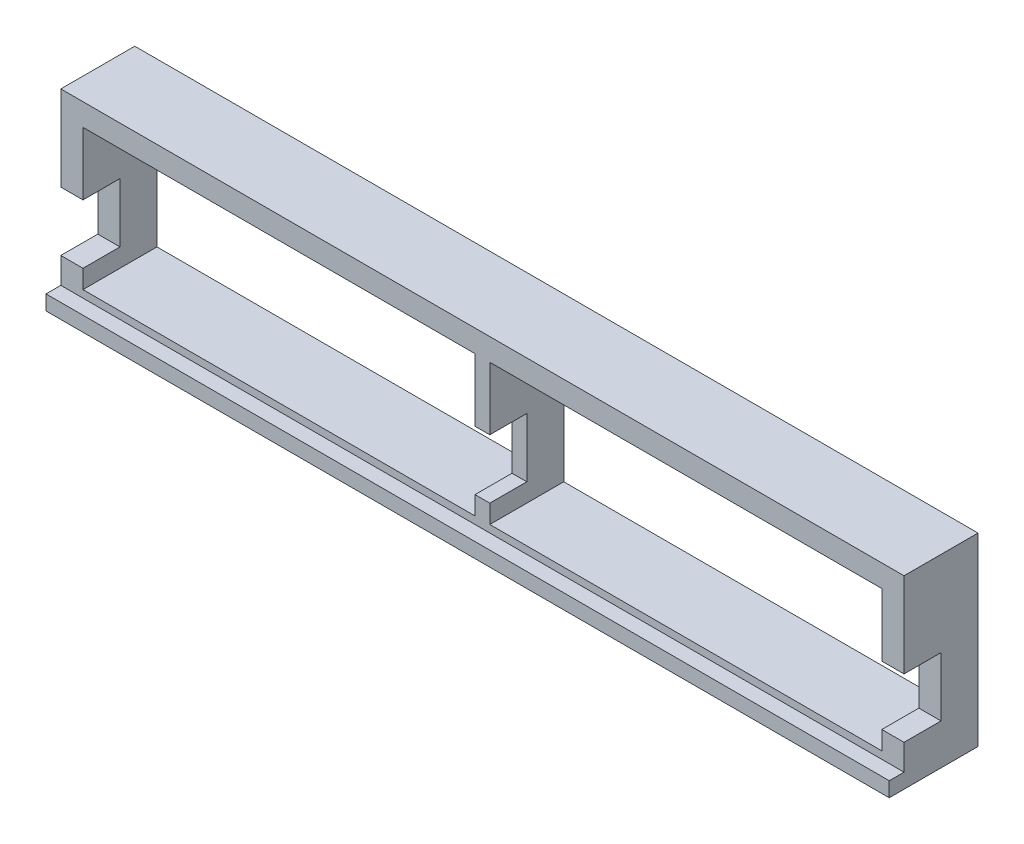
ISO-10303-21;
HEADER;
FILE_DESCRIPTION(('STEP AP214'),'2;1');
FILE_NAME('part.step','',(''),(''),'','','');
FILE_SCHEMA(('AUTOMOTIVE_DESIGN { 1 0 10303 214 1 1 1 1 }'));
ENDSEC;
DATA;
#1=APPLICATION_CONTEXT('core data for automotive mechanical design processes');
#2=APPLICATION_PROTOCOL_DEFINITION('international standard','automotive_design',2000,#1);
#3=PRODUCT_CONTEXT('',#1,'mechanical');
#4=PRODUCT('Part','Part','',(#3));
#5=PRODUCT_RELATED_PRODUCT_CATEGORY('part','',(#4));
#6=PRODUCT_DEFINITION_FORMATION('','',#4);
#7=PRODUCT_DEFINITION_CONTEXT('part definition',#1,'design');
#8=PRODUCT_DEFINITION('design','',#6,#7);
#9=PRODUCT_DEFINITION_SHAPE('','',#8);
#10=(LENGTH_UNIT() NAMED_UNIT(*) SI_UNIT(.MILLI.,.METRE.));
#11=(NAMED_UNIT(*) PLANE_ANGLE_UNIT() SI_UNIT($,.RADIAN.));
#12=(NAMED_UNIT(*) SI_UNIT($,.STERADIAN.) SOLID_ANGLE_UNIT());
#13=UNCERTAINTY_MEASURE_WITH_UNIT(LENGTH_MEASURE(1.E-05),#10,'distance_accuracy_value','');
#14=(GEOMETRIC_REPRESENTATION_CONTEXT(3) GLOBAL_UNCERTAINTY_ASSIGNED_CONTEXT((#13)) GLOBAL_UNIT_ASSIGNED_CONTEXT((#10,
#11,#12)) REPRESENTATION_CONTEXT('',''));
#15=CARTESIAN_POINT('',(0.,0.,0.));
#16=DIRECTION('',(0.,0.,1.));
#17=DIRECTION('',(1.,0.,0.));
#18=AXIS2_PLACEMENT_3D('',#15,#16,#17);
#19=CARTESIAN_POINT('',(0.,0.,10.));
#20=DIRECTION('',(0.,0.,1.));
#21=DIRECTION('',(1.,0.,0.));
#22=AXIS2_PLACEMENT_3D('',#19,#20,#21);
#23=PLANE('',#22);
#24=DIRECTION('',(1.,0.,0.));
#25=VECTOR('',#24,1.);
#26=CARTESIAN_POINT('',(0.,-7.,10.));
#27=LINE('',#26,#25);
#28=CARTESIAN_POINT('',(-57.,-7.,10.));
#29=VERTEX_POINT('',#28);
#30=CARTESIAN_POINT('',(-54.,-7.,10.));
#31=VERTEX_POINT('',#30);
#32=EDGE_CURVE('E11',#29,#31,#27,.T.);
#33=ORIENTED_EDGE('',*,*,#32,.F.);
#34=DIRECTION('',(0.,1.,0.));
#35=VECTOR('',#34,1.);
#36=CARTESIAN_POINT('',(-57.,0.,10.));
#37=LINE('',#36,#35);
#38=CARTESIAN_POINT('',(-57.,-10.5,10.));
#39=VERTEX_POINT('',#38);
#40=EDGE_CURVE('E232',#39,#29,#37,.T.);
#41=ORIENTED_EDGE('',*,*,#40,.F.);
#42=DIRECTION('',(-1.,0.,0.));
#43=VECTOR('',#42,1.);
#44=CARTESIAN_POINT('',(-57.,-10.5,10.));
#45=LINE('',#44,#43);
#46=CARTESIAN_POINT('',(57.,-10.5,10.));
#47=VERTEX_POINT('',#46);
#48=EDGE_CURVE('E252',#47,#39,#45,.T.);
#49=ORIENTED_EDGE('',*,*,#48,.F.);
#50=DIRECTION('',(0.,1.,0.));
#51=VECTOR('',#50,1.);
#52=CARTESIAN_POINT('',(57.,0.,10.));
#53=LINE('',#52,#51);
#54=CARTESIAN_POINT('',(57.,-7.,10.));
#55=VERTEX_POINT('',#54);
#56=EDGE_CURVE('E237',#47,#55,#53,.T.);
#57=ORIENTED_EDGE('',*,*,#56,.T.);
#58=CARTESIAN_POINT('',(54.,-7.,10.));
#59=VERTEX_POINT('',#58);
#60=EDGE_CURVE('E39',#59,#55,#27,.T.);
#61=ORIENTED_EDGE('',*,*,#60,.F.);
#62=DIRECTION('',(0.,1.,0.));
#63=VECTOR('',#62,1.);
#64=CARTESIAN_POINT('',(54.,0.,10.));
#65=LINE('',#64,#63);
#66=CARTESIAN_POINT('',(54.,-9.5,10.));
#67=VERTEX_POINT('',#66);
#68=EDGE_CURVE('E279',#67,#59,#65,.T.);
#69=ORIENTED_EDGE('',*,*,#68,.F.);
#70=DIRECTION('',(1.,0.,0.));
#71=VECTOR('',#70,1.);
#72=CARTESIAN_POINT('',(0.,-9.5,10.));
#73=LINE('',#72,#71);
#74=CARTESIAN_POINT('',(0.999999999999991,-9.5,10.));
#75=VERTEX_POINT('',#74);
#76=EDGE_CURVE('E265',#75,#67,#73,.T.);
#77=ORIENTED_EDGE('',*,*,#76,.F.);
#78=DIRECTION('',(0.,-1.,0.));
#79=VECTOR('',#78,1.);
#80=CARTESIAN_POINT('',(0.999999999999992,0.,10.));
#81=LINE('',#80,#79);
#82=CARTESIAN_POINT('',(0.999999999999994,-7.,10.));
#83=VERTEX_POINT('',#82);
#84=EDGE_CURVE('E268',#83,#75,#81,.T.);
#85=ORIENTED_EDGE('',*,*,#84,.F.);
#86=CARTESIAN_POINT('',(-1.00000000000001,-7.,10.));
#87=VERTEX_POINT('',#86);
#88=EDGE_CURVE('E44',#87,#83,#27,.T.);
#89=ORIENTED_EDGE('',*,*,#88,.F.);
#90=DIRECTION('',(0.,-1.,0.));
#91=VECTOR('',#90,1.);
#92=CARTESIAN_POINT('',(-1.00000000000001,0.,10.));
#93=LINE('',#92,#91);
#94=CARTESIAN_POINT('',(-1.00000000000001,-9.5,10.));
#95=VERTEX_POINT('',#94);
#96=EDGE_CURVE('E282',#87,#95,#93,.T.);
#97=ORIENTED_EDGE('',*,*,#96,.T.);
#98=CARTESIAN_POINT('',(-54.,-9.5,10.));
#99=VERTEX_POINT('',#98);
#100=EDGE_CURVE('E270',#99,#95,#73,.T.);
#101=ORIENTED_EDGE('',*,*,#100,.F.);
#102=DIRECTION('',(0.,1.,0.));
#103=VECTOR('',#102,1.);
#104=CARTESIAN_POINT('',(-54.,0.,10.));
#105=LINE('',#104,#103);
#106=EDGE_CURVE('E286',#99,#31,#105,.T.);
#107=ORIENTED_EDGE('',*,*,#106,.T.);
#108=EDGE_LOOP('',(#33,#41,#49,#57,#61,#69,#77,#85,#89,#97,#101,#107));
#109=FACE_BOUND('',#108,.T.);
#110=ADVANCED_FACE('F35',(#109),#23,.T.);
#111=CARTESIAN_POINT('',(0.,-12.5,10.));
#112=DIRECTION('',(0.,1.,0.));
#113=DIRECTION('',(0.,0.,1.));
#114=AXIS2_PLACEMENT_3D('',#111,#112,#113);
#115=PLANE('',#114);
#116=DIRECTION('',(1.,0.,0.));
#117=VECTOR('',#116,1.);
#118=CARTESIAN_POINT('',(0.,-12.5,0.));
#119=LINE('',#118,#117);
#120=CARTESIAN_POINT('',(-57.,-12.5,0.));
#121=VERTEX_POINT('',#120);
#122=CARTESIAN_POINT('',(57.,-12.5,0.));
#123=VERTEX_POINT('',#122);
#124=EDGE_CURVE('E350',#121,#123,#119,.T.);
#125=ORIENTED_EDGE('',*,*,#124,.T.);
#126=DIRECTION('',(0.,0.,-1.));
#127=VECTOR('',#126,1.);
#128=CARTESIAN_POINT('',(57.,-12.5,10.));
#129=LINE('',#128,#127);
#130=CARTESIAN_POINT('',(57.,-12.5,12.));
#131=VERTEX_POINT('',#130);
#132=EDGE_CURVE('E217',#131,#123,#129,.T.);
#133=ORIENTED_EDGE('',*,*,#132,.F.);
#134=DIRECTION('',(1.,0.,0.));
#135=VECTOR('',#134,1.);
#136=CARTESIAN_POINT('',(-57.,-12.5,12.));
#137=LINE('',#136,#135);
#138=CARTESIAN_POINT('',(-57.,-12.5,12.));
#139=VERTEX_POINT('',#138);
#140=EDGE_CURVE('E419',#139,#131,#137,.T.);
#141=ORIENTED_EDGE('',*,*,#140,.F.);
#142=DIRECTION('',(0.,0.,-1.));
#143=VECTOR('',#142,1.);
#144=CARTESIAN_POINT('',(-57.,-12.5,10.));
#145=LINE('',#144,#143);
#146=EDGE_CURVE('E314',#139,#121,#145,.T.);
#147=ORIENTED_EDGE('',*,*,#146,.T.);
#148=EDGE_LOOP('',(#125,#133,#141,#147));
#149=FACE_BOUND('',#148,.T.);
#150=ADVANCED_FACE('F446',(#149),#115,.F.);
#151=CARTESIAN_POINT('',(57.,0.,10.));
#152=DIRECTION('',(-1.,0.,0.));
#153=DIRECTION('',(0.,0.,1.));
#154=AXIS2_PLACEMENT_3D('',#151,#152,#153);
#155=PLANE('',#154);
#156=DIRECTION('',(0.,-1.,0.));
#157=VECTOR('',#156,1.);
#158=CARTESIAN_POINT('',(57.,0.,5.));
#159=LINE('',#158,#157);
#160=CARTESIAN_POINT('',(57.,0.999999999999999,5.));
#161=VERTEX_POINT('',#160);
#162=CARTESIAN_POINT('',(57.,-7.,5.));
#163=VERTEX_POINT('',#162);
#164=EDGE_CURVE('E257',#161,#163,#159,.T.);
#165=ORIENTED_EDGE('',*,*,#164,.T.);
#166=DIRECTION('',(0.,0.,1.));
#167=VECTOR('',#166,1.);
#168=CARTESIAN_POINT('',(57.,-7.,10.));
#169=LINE('',#168,#167);
#170=EDGE_CURVE('E405',#163,#55,#169,.T.);
#171=ORIENTED_EDGE('',*,*,#170,.T.);
#172=ORIENTED_EDGE('',*,*,#56,.F.);
#173=DIRECTION('',(0.,0.,-1.));
#174=VECTOR('',#173,1.);
#175=CARTESIAN_POINT('',(57.,-10.5,12.));
#176=LINE('',#175,#174);
#177=CARTESIAN_POINT('',(57.,-10.5,12.));
#178=VERTEX_POINT('',#177);
#179=EDGE_CURVE('E368',#178,#47,#176,.T.);
#180=ORIENTED_EDGE('',*,*,#179,.F.);
#181=DIRECTION('',(0.,1.,0.));
#182=VECTOR('',#181,1.);
#183=CARTESIAN_POINT('',(57.,-12.5,12.));
#184=LINE('',#183,#182);
#185=EDGE_CURVE('E421',#131,#178,#184,.T.);
#186=ORIENTED_EDGE('',*,*,#185,.F.);
#187=ORIENTED_EDGE('',*,*,#132,.T.);
#188=DIRECTION('',(0.,1.,0.));
#189=VECTOR('',#188,1.);
#190=CARTESIAN_POINT('',(57.,0.,0.));
#191=LINE('',#190,#189);
#192=CARTESIAN_POINT('',(57.,12.5,0.));
#193=VERTEX_POINT('',#192);
#194=EDGE_CURVE('E347',#123,#193,#191,.T.);
#195=ORIENTED_EDGE('',*,*,#194,.T.);
#196=DIRECTION('',(0.,0.,-1.));
#197=VECTOR('',#196,1.);
#198=CARTESIAN_POINT('',(57.,12.5,10.));
#199=LINE('',#198,#197);
#200=CARTESIAN_POINT('',(57.,12.5,10.));
#201=VERTEX_POINT('',#200);
#202=EDGE_CURVE('E339',#201,#193,#199,.T.);
#203=ORIENTED_EDGE('',*,*,#202,.F.);
#204=CARTESIAN_POINT('',(57.,0.999999999999999,10.));
#205=VERTEX_POINT('',#204);
#206=EDGE_CURVE('E241',#205,#201,#53,.T.);
#207=ORIENTED_EDGE('',*,*,#206,.F.);
#208=DIRECTION('',(0.,0.,-1.));
#209=VECTOR('',#208,1.);
#210=CARTESIAN_POINT('',(57.,0.999999999999999,10.));
#211=LINE('',#210,#209);
#212=EDGE_CURVE('E389',#205,#161,#211,.T.);
#213=ORIENTED_EDGE('',*,*,#212,.T.);
#214=EDGE_LOOP('',(#165,#171,#172,#180,#186,#187,#195,#203,#207,#213));
#215=FACE_BOUND('',#214,.T.);
#216=ADVANCED_FACE('F435',(#215),#155,.F.);
#217=CARTESIAN_POINT('',(0.,12.5,10.));
#218=DIRECTION('',(0.,1.,0.));
#219=DIRECTION('',(0.,0.,1.));
#220=AXIS2_PLACEMENT_3D('',#217,#218,#219);
#221=PLANE('',#220);
#222=DIRECTION('',(1.,0.,0.));
#223=VECTOR('',#222,1.);
#224=CARTESIAN_POINT('',(0.,12.5,0.));
#225=LINE('',#224,#223);
#226=CARTESIAN_POINT('',(-57.,12.5,0.));
#227=VERTEX_POINT('',#226);
#228=EDGE_CURVE('E344',#227,#193,#225,.T.);
#229=ORIENTED_EDGE('',*,*,#228,.F.);
#230=DIRECTION('',(0.,0.,-1.));
#231=VECTOR('',#230,1.);
#232=CARTESIAN_POINT('',(-57.,12.5,10.));
#233=LINE('',#232,#231);
#234=CARTESIAN_POINT('',(-57.,12.5,10.));
#235=VERTEX_POINT('',#234);
#236=EDGE_CURVE('E316',#235,#227,#233,.T.);
#237=ORIENTED_EDGE('',*,*,#236,.F.);
#238=DIRECTION('',(1.,0.,0.));
#239=VECTOR('',#238,1.);
#240=CARTESIAN_POINT('',(0.,12.5,10.));
#241=LINE('',#240,#239);
#242=EDGE_CURVE('E231',#235,#201,#241,.T.);
#243=ORIENTED_EDGE('',*,*,#242,.T.);
#244=ORIENTED_EDGE('',*,*,#202,.T.);
#245=EDGE_LOOP('',(#229,#237,#243,#244));
#246=FACE_BOUND('',#245,.T.);
#247=ADVANCED_FACE('F441',(#246),#221,.T.);
#248=CARTESIAN_POINT('',(-1.00000000000001,0.,10.));
#249=DIRECTION('',(1.,0.,0.));
#250=DIRECTION('',(0.,1.,0.));
#251=AXIS2_PLACEMENT_3D('',#248,#249,#250);
#252=PLANE('',#251);
#253=ORIENTED_EDGE('',*,*,#96,.F.);
#254=DIRECTION('',(0.,0.,-1.));
#255=VECTOR('',#254,1.);
#256=CARTESIAN_POINT('',(-1.00000000000001,-7.,10.));
#257=LINE('',#256,#255);
#258=CARTESIAN_POINT('',(-1.00000000000001,-7.,5.));
#259=VERTEX_POINT('',#258);
#260=EDGE_CURVE('E403',#87,#259,#257,.T.);
#261=ORIENTED_EDGE('',*,*,#260,.T.);
#262=DIRECTION('',(0.,1.,0.));
#263=VECTOR('',#262,1.);
#264=CARTESIAN_POINT('',(-1.00000000000001,0.,5.));
#265=LINE('',#264,#263);
#266=CARTESIAN_POINT('',(-1.00000000000001,0.999999999999999,5.));
#267=VERTEX_POINT('',#266);
#268=EDGE_CURVE('E387',#259,#267,#265,.T.);
#269=ORIENTED_EDGE('',*,*,#268,.T.);
#270=DIRECTION('',(0.,0.,1.));
#271=VECTOR('',#270,1.);
#272=CARTESIAN_POINT('',(-1.00000000000001,0.999999999999999,10.));
#273=LINE('',#272,#271);
#274=CARTESIAN_POINT('',(-1.00000000000001,0.999999999999999,10.));
#275=VERTEX_POINT('',#274);
#276=EDGE_CURVE('E386',#267,#275,#273,.T.);
#277=ORIENTED_EDGE('',*,*,#276,.T.);
#278=CARTESIAN_POINT('',(-1.00000000000001,9.5,10.));
#279=VERTEX_POINT('',#278);
#280=EDGE_CURVE('E283',#279,#275,#93,.T.);
#281=ORIENTED_EDGE('',*,*,#280,.F.);
#282=DIRECTION('',(0.,0.,-1.));
#283=VECTOR('',#282,1.);
#284=CARTESIAN_POINT('',(-1.00000000000001,9.5,10.));
#285=LINE('',#284,#283);
#286=CARTESIAN_POINT('',(-1.00000000000001,9.5,0.));
#287=VERTEX_POINT('',#286);
#288=EDGE_CURVE('E327',#279,#287,#285,.T.);
#289=ORIENTED_EDGE('',*,*,#288,.T.);
#290=DIRECTION('',(0.,-1.,0.));
#291=VECTOR('',#290,1.);
#292=CARTESIAN_POINT('',(-1.00000000000001,0.,0.));
#293=LINE('',#292,#291);
#294=CARTESIAN_POINT('',(-1.00000000000001,-9.5,0.));
#295=VERTEX_POINT('',#294);
#296=EDGE_CURVE('E312',#287,#295,#293,.T.);
#297=ORIENTED_EDGE('',*,*,#296,.T.);
#298=DIRECTION('',(0.,0.,-1.));
#299=VECTOR('',#298,1.);
#300=CARTESIAN_POINT('',(-1.00000000000001,-9.5,10.));
#301=LINE('',#300,#299);
#302=EDGE_CURVE('E301',#95,#295,#301,.T.);
#303=ORIENTED_EDGE('',*,*,#302,.F.);
#304=EDGE_LOOP('',(#253,#261,#269,#277,#281,#289,#297,#303));
#305=FACE_BOUND('',#304,.T.);
#306=ADVANCED_FACE('F309',(#305),#252,.F.);
#307=CARTESIAN_POINT('',(0.,-9.5,10.));
#308=DIRECTION('',(0.,1.,0.));
#309=DIRECTION('',(0.,0.,1.));
#310=AXIS2_PLACEMENT_3D('',#307,#308,#309);
#311=PLANE('',#310);
#312=DIRECTION('',(1.,0.,0.));
#313=VECTOR('',#312,1.);
#314=CARTESIAN_POINT('',(0.,-9.5,0.));
#315=LINE('',#314,#313);
#316=CARTESIAN_POINT('',(-54.,-9.5,0.));
#317=VERTEX_POINT('',#316);
#318=EDGE_CURVE('E356',#317,#295,#315,.T.);
#319=ORIENTED_EDGE('',*,*,#318,.F.);
#320=DIRECTION('',(0.,0.,-1.));
#321=VECTOR('',#320,1.);
#322=CARTESIAN_POINT('',(-54.,-9.5,10.));
#323=LINE('',#322,#321);
#324=EDGE_CURVE('E303',#99,#317,#323,.T.);
#325=ORIENTED_EDGE('',*,*,#324,.F.);
#326=ORIENTED_EDGE('',*,*,#100,.T.);
#327=ORIENTED_EDGE('',*,*,#302,.T.);
#328=EDGE_LOOP('',(#319,#325,#326,#327));
#329=FACE_BOUND('',#328,.T.);
#330=ADVANCED_FACE('F299',(#329),#311,.T.);
#331=CARTESIAN_POINT('',(-54.,0.,10.));
#332=DIRECTION('',(-1.,0.,0.));
#333=DIRECTION('',(0.,0.,1.));
#334=AXIS2_PLACEMENT_3D('',#331,#332,#333);
#335=PLANE('',#334);
#336=DIRECTION('',(0.,-1.,0.));
#337=VECTOR('',#336,1.);
#338=CARTESIAN_POINT('',(-54.,0.,5.));
#339=LINE('',#338,#337);
#340=CARTESIAN_POINT('',(-54.,0.999999999999999,5.));
#341=VERTEX_POINT('',#340);
#342=CARTESIAN_POINT('',(-54.,-7.,5.));
#343=VERTEX_POINT('',#342);
#344=EDGE_CURVE('E412',#341,#343,#339,.T.);
#345=ORIENTED_EDGE('',*,*,#344,.T.);
#346=DIRECTION('',(0.,0.,1.));
#347=VECTOR('',#346,1.);
#348=CARTESIAN_POINT('',(-54.,-7.,10.));
#349=LINE('',#348,#347);
#350=EDGE_CURVE('E400',#343,#31,#349,.T.);
#351=ORIENTED_EDGE('',*,*,#350,.T.);
#352=ORIENTED_EDGE('',*,*,#106,.F.);
#353=ORIENTED_EDGE('',*,*,#324,.T.);
#354=DIRECTION('',(0.,1.,0.));
#355=VECTOR('',#354,1.);
#356=CARTESIAN_POINT('',(-54.,0.,0.));
#357=LINE('',#356,#355);
#358=CARTESIAN_POINT('',(-54.,9.5,0.));
#359=VERTEX_POINT('',#358);
#360=EDGE_CURVE('E354',#317,#359,#357,.T.);
#361=ORIENTED_EDGE('',*,*,#360,.T.);
#362=DIRECTION('',(0.,0.,-1.));
#363=VECTOR('',#362,1.);
#364=CARTESIAN_POINT('',(-54.,9.5,10.));
#365=LINE('',#364,#363);
#366=CARTESIAN_POINT('',(-54.,9.5,10.));
#367=VERTEX_POINT('',#366);
#368=EDGE_CURVE('E318',#367,#359,#365,.T.);
#369=ORIENTED_EDGE('',*,*,#368,.F.);
#370=CARTESIAN_POINT('',(-54.,0.999999999999999,10.));
#371=VERTEX_POINT('',#370);
#372=EDGE_CURVE('E288',#371,#367,#105,.T.);
#373=ORIENTED_EDGE('',*,*,#372,.F.);
#374=DIRECTION('',(0.,0.,-1.));
#375=VECTOR('',#374,1.);
#376=CARTESIAN_POINT('',(-54.,0.999999999999999,10.));
#377=LINE('',#376,#375);
#378=EDGE_CURVE('E51',#371,#341,#377,.T.);
#379=ORIENTED_EDGE('',*,*,#378,.T.);
#380=EDGE_LOOP('',(#345,#351,#352,#353,#361,#369,#373,#379));
#381=FACE_BOUND('',#380,.T.);
#382=ADVANCED_FACE('F379',(#381),#335,.F.);
#383=CARTESIAN_POINT('',(0.999999999999991,-9.5,0.));
#384=VERTEX_POINT('',#383);
#385=CARTESIAN_POINT('',(54.,-9.5,0.));
#386=VERTEX_POINT('',#385);
#387=EDGE_CURVE('E246',#384,#386,#315,.T.);
#388=ORIENTED_EDGE('',*,*,#387,.F.);
#389=DIRECTION('',(0.,0.,-1.));
#390=VECTOR('',#389,1.);
#391=CARTESIAN_POINT('',(0.999999999999991,-9.5,10.));
#392=LINE('',#391,#390);
#393=EDGE_CURVE('E326',#75,#384,#392,.T.);
#394=ORIENTED_EDGE('',*,*,#393,.F.);
#395=ORIENTED_EDGE('',*,*,#76,.T.);
#396=DIRECTION('',(0.,0.,-1.));
#397=VECTOR('',#396,1.);
#398=CARTESIAN_POINT('',(54.,-9.5,10.));
#399=LINE('',#398,#397);
#400=EDGE_CURVE('E235',#67,#386,#399,.T.);
#401=ORIENTED_EDGE('',*,*,#400,.T.);
#402=EDGE_LOOP('',(#388,#394,#395,#401));
#403=FACE_BOUND('',#402,.T.);
#404=ADVANCED_FACE('F489',(#403),#311,.T.);
#405=CARTESIAN_POINT('',(0.999999999999992,0.,10.));
#406=DIRECTION('',(1.,0.,0.));
#407=DIRECTION('',(0.,1.,0.));
#408=AXIS2_PLACEMENT_3D('',#405,#406,#407);
#409=PLANE('',#408);
#410=DIRECTION('',(0.,0.,-1.));
#411=VECTOR('',#410,1.);
#412=CARTESIAN_POINT('',(0.999999999999992,-7.,10.));
#413=LINE('',#412,#411);
#414=CARTESIAN_POINT('',(0.999999999999994,-7.,5.));
#415=VERTEX_POINT('',#414);
#416=EDGE_CURVE('E398',#83,#415,#413,.T.);
#417=ORIENTED_EDGE('',*,*,#416,.F.);
#418=ORIENTED_EDGE('',*,*,#84,.T.);
#419=ORIENTED_EDGE('',*,*,#393,.T.);
#420=DIRECTION('',(0.,-1.,0.));
#421=VECTOR('',#420,1.);
#422=CARTESIAN_POINT('',(0.999999999999992,0.,0.));
#423=LINE('',#422,#421);
#424=CARTESIAN_POINT('',(0.999999999999994,9.5,0.));
#425=VERTEX_POINT('',#424);
#426=EDGE_CURVE('E363',#425,#384,#423,.T.);
#427=ORIENTED_EDGE('',*,*,#426,.F.);
#428=DIRECTION('',(0.,0.,-1.));
#429=VECTOR('',#428,1.);
#430=CARTESIAN_POINT('',(0.999999999999994,9.5,10.));
#431=LINE('',#430,#429);
#432=CARTESIAN_POINT('',(0.999999999999994,9.5,10.));
#433=VERTEX_POINT('',#432);
#434=EDGE_CURVE('E325',#433,#425,#431,.T.);
#435=ORIENTED_EDGE('',*,*,#434,.F.);
#436=CARTESIAN_POINT('',(0.999999999999993,0.999999999999999,10.));
#437=VERTEX_POINT('',#436);
#438=EDGE_CURVE('E271',#433,#437,#81,.T.);
#439=ORIENTED_EDGE('',*,*,#438,.T.);
#440=DIRECTION('',(0.,0.,1.));
#441=VECTOR('',#440,1.);
#442=CARTESIAN_POINT('',(0.999999999999993,0.999999999999999,10.));
#443=LINE('',#442,#441);
#444=CARTESIAN_POINT('',(0.999999999999994,0.999999999999999,5.));
#445=VERTEX_POINT('',#444);
#446=EDGE_CURVE('E59',#445,#437,#443,.T.);
#447=ORIENTED_EDGE('',*,*,#446,.F.);
#448=DIRECTION('',(0.,1.,0.));
#449=VECTOR('',#448,1.);
#450=CARTESIAN_POINT('',(0.999999999999992,0.,5.));
#451=LINE('',#450,#449);
#452=EDGE_CURVE('E410',#415,#445,#451,.T.);
#453=ORIENTED_EDGE('',*,*,#452,.F.);
#454=EDGE_LOOP('',(#417,#418,#419,#427,#435,#439,#447,#453));
#455=FACE_BOUND('',#454,.T.);
#456=ADVANCED_FACE('F37',(#455),#409,.T.);
#457=CARTESIAN_POINT('',(0.,9.5,10.));
#458=DIRECTION('',(0.,1.,0.));
#459=DIRECTION('',(0.,0.,1.));
#460=AXIS2_PLACEMENT_3D('',#457,#458,#459);
#461=PLANE('',#460);
#462=DIRECTION('',(1.,0.,0.));
#463=VECTOR('',#462,1.);
#464=CARTESIAN_POINT('',(0.,9.5,0.));
#465=LINE('',#464,#463);
#466=CARTESIAN_POINT('',(54.,9.5,0.));
#467=VERTEX_POINT('',#466);
#468=EDGE_CURVE('E361',#425,#467,#465,.T.);
#469=ORIENTED_EDGE('',*,*,#468,.T.);
#470=DIRECTION('',(0.,0.,-1.));
#471=VECTOR('',#470,1.);
#472=CARTESIAN_POINT('',(54.,9.5,10.));
#473=LINE('',#472,#471);
#474=CARTESIAN_POINT('',(54.,9.5,10.));
#475=VERTEX_POINT('',#474);
#476=EDGE_CURVE('E323',#475,#467,#473,.T.);
#477=ORIENTED_EDGE('',*,*,#476,.F.);
#478=DIRECTION('',(1.,0.,0.));
#479=VECTOR('',#478,1.);
#480=CARTESIAN_POINT('',(0.,9.5,10.));
#481=LINE('',#480,#479);
#482=EDGE_CURVE('E274',#433,#475,#481,.T.);
#483=ORIENTED_EDGE('',*,*,#482,.F.);
#484=ORIENTED_EDGE('',*,*,#434,.T.);
#485=EDGE_LOOP('',(#469,#477,#483,#484));
#486=FACE_BOUND('',#485,.T.);
#487=ADVANCED_FACE('F486',(#486),#461,.F.);
#488=EDGE_CURVE('E353',#359,#287,#465,.T.);
#489=ORIENTED_EDGE('',*,*,#488,.T.);
#490=ORIENTED_EDGE('',*,*,#288,.F.);
#491=EDGE_CURVE('E278',#367,#279,#481,.T.);
#492=ORIENTED_EDGE('',*,*,#491,.F.);
#493=ORIENTED_EDGE('',*,*,#368,.T.);
#494=EDGE_LOOP('',(#489,#490,#492,#493));
#495=FACE_BOUND('',#494,.T.);
#496=ADVANCED_FACE('F382',(#495),#461,.F.);
#497=CARTESIAN_POINT('',(54.,0.,10.));
#498=DIRECTION('',(-1.,0.,0.));
#499=DIRECTION('',(0.,0.,1.));
#500=AXIS2_PLACEMENT_3D('',#497,#498,#499);
#501=PLANE('',#500);
#502=DIRECTION('',(0.,0.,1.));
#503=VECTOR('',#502,1.);
#504=CARTESIAN_POINT('',(54.,-7.,10.));
#505=LINE('',#504,#503);
#506=CARTESIAN_POINT('',(54.,-7.,5.));
#507=VERTEX_POINT('',#506);
#508=EDGE_CURVE('E392',#507,#59,#505,.T.);
#509=ORIENTED_EDGE('',*,*,#508,.F.);
#510=DIRECTION('',(0.,-1.,0.));
#511=VECTOR('',#510,1.);
#512=CARTESIAN_POINT('',(54.,0.,5.));
#513=LINE('',#512,#511);
#514=CARTESIAN_POINT('',(54.,0.999999999999999,5.));
#515=VERTEX_POINT('',#514);
#516=EDGE_CURVE('E408',#515,#507,#513,.T.);
#517=ORIENTED_EDGE('',*,*,#516,.F.);
#518=DIRECTION('',(0.,0.,-1.));
#519=VECTOR('',#518,1.);
#520=CARTESIAN_POINT('',(54.,0.999999999999999,10.));
#521=LINE('',#520,#519);
#522=CARTESIAN_POINT('',(54.,0.999999999999999,10.));
#523=VERTEX_POINT('',#522);
#524=EDGE_CURVE('E626',#523,#515,#521,.T.);
#525=ORIENTED_EDGE('',*,*,#524,.F.);
#526=EDGE_CURVE('E277',#523,#475,#65,.T.);
#527=ORIENTED_EDGE('',*,*,#526,.T.);
#528=ORIENTED_EDGE('',*,*,#476,.T.);
#529=DIRECTION('',(0.,1.,0.));
#530=VECTOR('',#529,1.);
#531=CARTESIAN_POINT('',(54.,0.,0.));
#532=LINE('',#531,#530);
#533=EDGE_CURVE('E358',#386,#467,#532,.T.);
#534=ORIENTED_EDGE('',*,*,#533,.F.);
#535=ORIENTED_EDGE('',*,*,#400,.F.);
#536=ORIENTED_EDGE('',*,*,#68,.T.);
#537=EDGE_LOOP('',(#509,#517,#525,#527,#528,#534,#535,#536));
#538=FACE_BOUND('',#537,.T.);
#539=ADVANCED_FACE('F473',(#538),#501,.T.);
#540=CARTESIAN_POINT('',(-57.,0.,10.));
#541=DIRECTION('',(-1.,0.,0.));
#542=DIRECTION('',(0.,0.,1.));
#543=AXIS2_PLACEMENT_3D('',#540,#541,#542);
#544=PLANE('',#543);
#545=DIRECTION('',(0.,0.,1.));
#546=VECTOR('',#545,1.);
#547=CARTESIAN_POINT('',(-57.,-7.,10.));
#548=LINE('',#547,#546);
#549=CARTESIAN_POINT('',(-57.,-7.,5.));
#550=VERTEX_POINT('',#549);
#551=EDGE_CURVE('E640',#550,#29,#548,.T.);
#552=ORIENTED_EDGE('',*,*,#551,.F.);
#553=DIRECTION('',(0.,-1.,0.));
#554=VECTOR('',#553,1.);
#555=CARTESIAN_POINT('',(-57.,0.999999999999999,5.));
#556=LINE('',#555,#554);
#557=CARTESIAN_POINT('',(-57.,0.999999999999999,5.));
#558=VERTEX_POINT('',#557);
#559=EDGE_CURVE('E225',#558,#550,#556,.T.);
#560=ORIENTED_EDGE('',*,*,#559,.F.);
#561=DIRECTION('',(0.,0.,-1.));
#562=VECTOR('',#561,1.);
#563=CARTESIAN_POINT('',(-57.,0.999999999999999,10.));
#564=LINE('',#563,#562);
#565=CARTESIAN_POINT('',(-57.,0.999999999999999,10.));
#566=VERTEX_POINT('',#565);
#567=EDGE_CURVE('E211',#566,#558,#564,.T.);
#568=ORIENTED_EDGE('',*,*,#567,.F.);
#569=EDGE_CURVE('E222',#566,#235,#37,.T.);
#570=ORIENTED_EDGE('',*,*,#569,.T.);
#571=ORIENTED_EDGE('',*,*,#236,.T.);
#572=DIRECTION('',(0.,1.,0.));
#573=VECTOR('',#572,1.);
#574=CARTESIAN_POINT('',(-57.,0.,0.));
#575=LINE('',#574,#573);
#576=EDGE_CURVE('E269',#121,#227,#575,.T.);
#577=ORIENTED_EDGE('',*,*,#576,.F.);
#578=ORIENTED_EDGE('',*,*,#146,.F.);
#579=DIRECTION('',(0.,-1.,0.));
#580=VECTOR('',#579,1.);
#581=CARTESIAN_POINT('',(-57.,-12.5,12.));
#582=LINE('',#581,#580);
#583=CARTESIAN_POINT('',(-57.,-10.5,12.));
#584=VERTEX_POINT('',#583);
#585=EDGE_CURVE('E256',#584,#139,#582,.T.);
#586=ORIENTED_EDGE('',*,*,#585,.F.);
#587=DIRECTION('',(0.,0.,-1.));
#588=VECTOR('',#587,1.);
#589=CARTESIAN_POINT('',(-57.,-10.5,12.));
#590=LINE('',#589,#588);
#591=EDGE_CURVE('E258',#584,#39,#590,.T.);
#592=ORIENTED_EDGE('',*,*,#591,.T.);
#593=ORIENTED_EDGE('',*,*,#40,.T.);
#594=EDGE_LOOP('',(#552,#560,#568,#570,#571,#577,#578,#586,#592,#593));
#595=FACE_BOUND('',#594,.T.);
#596=ADVANCED_FACE('F221',(#595),#544,.T.);
#597=DIRECTION('',(-1.,0.,0.));
#598=VECTOR('',#597,1.);
#599=CARTESIAN_POINT('',(0.,0.999999999999999,10.));
#600=LINE('',#599,#598);
#601=EDGE_CURVE('E218',#205,#523,#600,.T.);
#602=ORIENTED_EDGE('',*,*,#601,.F.);
#603=ORIENTED_EDGE('',*,*,#206,.T.);
#604=ORIENTED_EDGE('',*,*,#242,.F.);
#605=ORIENTED_EDGE('',*,*,#569,.F.);
#606=EDGE_CURVE('E208',#371,#566,#600,.T.);
#607=ORIENTED_EDGE('',*,*,#606,.F.);
#608=ORIENTED_EDGE('',*,*,#372,.T.);
#609=ORIENTED_EDGE('',*,*,#491,.T.);
#610=ORIENTED_EDGE('',*,*,#280,.T.);
#611=EDGE_CURVE('E216',#437,#275,#600,.T.);
#612=ORIENTED_EDGE('',*,*,#611,.F.);
#613=ORIENTED_EDGE('',*,*,#438,.F.);
#614=ORIENTED_EDGE('',*,*,#482,.T.);
#615=ORIENTED_EDGE('',*,*,#526,.F.);
#616=EDGE_LOOP('',(#602,#603,#604,#605,#607,#608,#609,#610,#612,#613,#614,#615));
#617=FACE_BOUND('',#616,.T.);
#618=ADVANCED_FACE('F229',(#617),#23,.T.);
#619=CARTESIAN_POINT('',(0.,0.,0.));
#620=DIRECTION('',(0.,0.,1.));
#621=DIRECTION('',(1.,0.,0.));
#622=AXIS2_PLACEMENT_3D('',#619,#620,#621);
#623=PLANE('',#622);
#624=ORIENTED_EDGE('',*,*,#387,.T.);
#625=ORIENTED_EDGE('',*,*,#533,.T.);
#626=ORIENTED_EDGE('',*,*,#468,.F.);
#627=ORIENTED_EDGE('',*,*,#426,.T.);
#628=EDGE_LOOP('',(#624,#625,#626,#627));
#629=FACE_BOUND('',#628,.T.);
#630=ORIENTED_EDGE('',*,*,#296,.F.);
#631=ORIENTED_EDGE('',*,*,#488,.F.);
#632=ORIENTED_EDGE('',*,*,#360,.F.);
#633=ORIENTED_EDGE('',*,*,#318,.T.);
#634=EDGE_LOOP('',(#630,#631,#632,#633));
#635=FACE_BOUND('',#634,.T.);
#636=ORIENTED_EDGE('',*,*,#124,.F.);
#637=ORIENTED_EDGE('',*,*,#576,.T.);
#638=ORIENTED_EDGE('',*,*,#228,.T.);
#639=ORIENTED_EDGE('',*,*,#194,.F.);
#640=EDGE_LOOP('',(#636,#637,#638,#639));
#641=FACE_BOUND('',#640,.T.);
#642=ADVANCED_FACE('F374',(#629,#635,#641),#623,.F.);
#643=CARTESIAN_POINT('',(-57.,-10.5,12.));
#644=DIRECTION('',(0.,-1.,0.));
#645=DIRECTION('',(0.,0.,-1.));
#646=AXIS2_PLACEMENT_3D('',#643,#644,#645);
#647=PLANE('',#646);
#648=ORIENTED_EDGE('',*,*,#48,.T.);
#649=ORIENTED_EDGE('',*,*,#591,.F.);
#650=DIRECTION('',(-1.,0.,0.));
#651=VECTOR('',#650,1.);
#652=CARTESIAN_POINT('',(-57.,-10.5,12.));
#653=LINE('',#652,#651);
#654=EDGE_CURVE('E263',#178,#584,#653,.T.);
#655=ORIENTED_EDGE('',*,*,#654,.F.);
#656=ORIENTED_EDGE('',*,*,#179,.T.);
#657=EDGE_LOOP('',(#648,#649,#655,#656));
#658=FACE_BOUND('',#657,.T.);
#659=ADVANCED_FACE('F430',(#658),#647,.F.);
#660=CARTESIAN_POINT('',(0.,0.,12.));
#661=DIRECTION('',(0.,0.,-1.));
#662=DIRECTION('',(-1.,0.,0.));
#663=AXIS2_PLACEMENT_3D('',#660,#661,#662);
#664=PLANE('',#663);
#665=ORIENTED_EDGE('',*,*,#585,.T.);
#666=ORIENTED_EDGE('',*,*,#140,.T.);
#667=ORIENTED_EDGE('',*,*,#185,.T.);
#668=ORIENTED_EDGE('',*,*,#654,.T.);
#669=EDGE_LOOP('',(#665,#666,#667,#668));
#670=FACE_BOUND('',#669,.T.);
#671=ADVANCED_FACE('F447',(#670),#664,.F.);
#672=CARTESIAN_POINT('',(57.00005,-7.,10.));
#673=DIRECTION('',(0.,-1.,0.));
#674=DIRECTION('',(0.,0.,-1.));
#675=AXIS2_PLACEMENT_3D('',#672,#673,#674);
#676=PLANE('',#675);
#677=DIRECTION('',(-1.,0.,0.));
#678=VECTOR('',#677,1.);
#679=CARTESIAN_POINT('',(57.00005,-7.,5.));
#680=LINE('',#679,#678);
#681=EDGE_CURVE('E642',#343,#550,#680,.T.);
#682=ORIENTED_EDGE('',*,*,#681,.T.);
#683=ORIENTED_EDGE('',*,*,#551,.T.);
#684=ORIENTED_EDGE('',*,*,#32,.T.);
#685=ORIENTED_EDGE('',*,*,#350,.F.);
#686=EDGE_LOOP('',(#682,#683,#684,#685));
#687=FACE_BOUND('',#686,.T.);
#688=ADVANCED_FACE('F449',(#687),#676,.F.);
#689=CARTESIAN_POINT('',(57.00005,0.999999999999999,10.));
#690=DIRECTION('',(0.,1.,0.));
#691=DIRECTION('',(0.,0.,1.));
#692=AXIS2_PLACEMENT_3D('',#689,#690,#691);
#693=PLANE('',#692);
#694=ORIENTED_EDGE('',*,*,#606,.T.);
#695=ORIENTED_EDGE('',*,*,#567,.T.);
#696=DIRECTION('',(-1.,0.,0.));
#697=VECTOR('',#696,1.);
#698=CARTESIAN_POINT('',(57.00005,0.999999999999999,5.));
#699=LINE('',#698,#697);
#700=EDGE_CURVE('E637',#341,#558,#699,.T.);
#701=ORIENTED_EDGE('',*,*,#700,.F.);
#702=ORIENTED_EDGE('',*,*,#378,.F.);
#703=EDGE_LOOP('',(#694,#695,#701,#702));
#704=FACE_BOUND('',#703,.T.);
#705=ADVANCED_FACE('F210',(#704),#693,.F.);
#706=CARTESIAN_POINT('',(57.00005,0.999999999999999,5.));
#707=DIRECTION('',(0.,0.,-1.));
#708=DIRECTION('',(0.,1.,0.));
#709=AXIS2_PLACEMENT_3D('',#706,#707,#708);
#710=PLANE('',#709);
#711=ORIENTED_EDGE('',*,*,#700,.T.);
#712=ORIENTED_EDGE('',*,*,#559,.T.);
#713=ORIENTED_EDGE('',*,*,#681,.F.);
#714=ORIENTED_EDGE('',*,*,#344,.F.);
#715=EDGE_LOOP('',(#711,#712,#713,#714));
#716=FACE_BOUND('',#715,.T.);
#717=ADVANCED_FACE('F561',(#716),#710,.F.);
#718=EDGE_CURVE('E639',#445,#267,#699,.T.);
#719=ORIENTED_EDGE('',*,*,#718,.F.);
#720=ORIENTED_EDGE('',*,*,#446,.T.);
#721=ORIENTED_EDGE('',*,*,#611,.T.);
#722=ORIENTED_EDGE('',*,*,#276,.F.);
#723=EDGE_LOOP('',(#719,#720,#721,#722));
#724=FACE_BOUND('',#723,.T.);
#725=ADVANCED_FACE('F563',(#724),#693,.F.);
#726=ORIENTED_EDGE('',*,*,#88,.T.);
#727=ORIENTED_EDGE('',*,*,#416,.T.);
#728=EDGE_CURVE('E644',#415,#259,#680,.T.);
#729=ORIENTED_EDGE('',*,*,#728,.T.);
#730=ORIENTED_EDGE('',*,*,#260,.F.);
#731=EDGE_LOOP('',(#726,#727,#729,#730));
#732=FACE_BOUND('',#731,.T.);
#733=ADVANCED_FACE('F458',(#732),#676,.F.);
#734=ORIENTED_EDGE('',*,*,#728,.F.);
#735=ORIENTED_EDGE('',*,*,#452,.T.);
#736=ORIENTED_EDGE('',*,*,#718,.T.);
#737=ORIENTED_EDGE('',*,*,#268,.F.);
#738=EDGE_LOOP('',(#734,#735,#736,#737));
#739=FACE_BOUND('',#738,.T.);
#740=ADVANCED_FACE('F574',(#739),#710,.F.);
#741=EDGE_CURVE('E641',#161,#515,#699,.T.);
#742=ORIENTED_EDGE('',*,*,#741,.T.);
#743=ORIENTED_EDGE('',*,*,#516,.T.);
#744=EDGE_CURVE('E630',#163,#507,#680,.T.);
#745=ORIENTED_EDGE('',*,*,#744,.F.);
#746=ORIENTED_EDGE('',*,*,#164,.F.);
#747=EDGE_LOOP('',(#742,#743,#745,#746));
#748=FACE_BOUND('',#747,.T.);
#749=ADVANCED_FACE('F573',(#748),#710,.F.);
#750=ORIENTED_EDGE('',*,*,#744,.T.);
#751=ORIENTED_EDGE('',*,*,#508,.T.);
#752=ORIENTED_EDGE('',*,*,#60,.T.);
#753=ORIENTED_EDGE('',*,*,#170,.F.);
#754=EDGE_LOOP('',(#750,#751,#752,#753));
#755=FACE_BOUND('',#754,.T.);
#756=ADVANCED_FACE('F457',(#755),#676,.F.);
#757=ORIENTED_EDGE('',*,*,#601,.T.);
#758=ORIENTED_EDGE('',*,*,#524,.T.);
#759=ORIENTED_EDGE('',*,*,#741,.F.);
#760=ORIENTED_EDGE('',*,*,#212,.F.);
#761=EDGE_LOOP('',(#757,#758,#759,#760));
#762=FACE_BOUND('',#761,.T.);
#763=ADVANCED_FACE('F562',(#762),#693,.F.);
#764=CLOSED_SHELL('',(#110,#150,#216,#247,#306,#330,#382,#404,#456,#487,#496,#539,#596,#618,
#642,#659,#671,#688,#705,#717,#725,#733,#740,#749,#756,#763));
#765=MANIFOLD_SOLID_BREP('B2',#764);
#766=ADVANCED_BREP_SHAPE_REPRESENTATION('',(#18,#765),#14);
#767=SHAPE_DEFINITION_REPRESENTATION(#9,#766);
ENDSEC;
END-ISO-10303-21;
